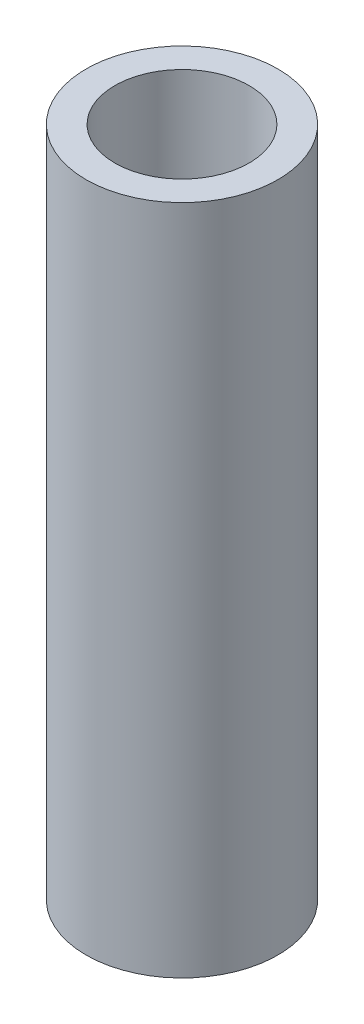
ISO-10303-21;
HEADER;
FILE_DESCRIPTION(('STEP AP214'),'2;1');
FILE_NAME('part.step','',(''),(''),'','','');
FILE_SCHEMA(('AUTOMOTIVE_DESIGN { 1 0 10303 214 1 1 1 1 }'));
ENDSEC;
DATA;
#1=APPLICATION_CONTEXT('core data for automotive mechanical design processes');
#2=APPLICATION_PROTOCOL_DEFINITION('international standard','automotive_design',2000,#1);
#3=PRODUCT_CONTEXT('',#1,'mechanical');
#4=PRODUCT('Part','Part','',(#3));
#5=PRODUCT_RELATED_PRODUCT_CATEGORY('part','',(#4));
#6=PRODUCT_DEFINITION_FORMATION('','',#4);
#7=PRODUCT_DEFINITION_CONTEXT('part definition',#1,'design');
#8=PRODUCT_DEFINITION('design','',#6,#7);
#9=PRODUCT_DEFINITION_SHAPE('','',#8);
#10=(LENGTH_UNIT() NAMED_UNIT(*) SI_UNIT(.MILLI.,.METRE.));
#11=(NAMED_UNIT(*) PLANE_ANGLE_UNIT() SI_UNIT($,.RADIAN.));
#12=(NAMED_UNIT(*) SI_UNIT($,.STERADIAN.) SOLID_ANGLE_UNIT());
#13=UNCERTAINTY_MEASURE_WITH_UNIT(LENGTH_MEASURE(1.E-05),#10,'distance_accuracy_value','');
#14=(GEOMETRIC_REPRESENTATION_CONTEXT(3) GLOBAL_UNCERTAINTY_ASSIGNED_CONTEXT((#13)) GLOBAL_UNIT_ASSIGNED_CONTEXT((#10,
#11,#12)) REPRESENTATION_CONTEXT('',''));
#15=CARTESIAN_POINT('',(0.,0.,0.));
#16=DIRECTION('',(0.,0.,1.));
#17=DIRECTION('',(1.,0.,0.));
#18=AXIS2_PLACEMENT_3D('',#15,#16,#17);
#19=CARTESIAN_POINT('',(0.,70.,0.));
#20=DIRECTION('',(0.,1.,0.));
#21=DIRECTION('',(0.,0.,1.));
#22=AXIS2_PLACEMENT_3D('',#19,#20,#21);
#23=PLANE('',#22);
#24=CARTESIAN_POINT('',(0.,70.,0.));
#25=DIRECTION('',(0.,1.,0.));
#26=DIRECTION('',(0.,0.,1.));
#27=AXIS2_PLACEMENT_3D('',#24,#25,#26);
#28=CIRCLE('',#27,10.);
#29=CARTESIAN_POINT('',(0.,70.,10.));
#30=VERTEX_POINT('',#29);
#31=EDGE_CURVE('E10',#30,#30,#28,.T.);
#32=ORIENTED_EDGE('',*,*,#31,.T.);
#33=EDGE_LOOP('',(#32));
#34=FACE_BOUND('',#33,.T.);
#35=CARTESIAN_POINT('',(0.,70.,0.));
#36=DIRECTION('',(0.,1.,0.));
#37=DIRECTION('',(0.,0.,1.));
#38=AXIS2_PLACEMENT_3D('',#35,#36,#37);
#39=CIRCLE('',#38,7.);
#40=CARTESIAN_POINT('',(0.,70.,7.));
#41=VERTEX_POINT('',#40);
#42=EDGE_CURVE('E55',#41,#41,#39,.T.);
#43=ORIENTED_EDGE('',*,*,#42,.F.);
#44=EDGE_LOOP('',(#43));
#45=FACE_BOUND('',#44,.T.);
#46=ADVANCED_FACE('F41',(#34,#45),#23,.T.);
#47=CARTESIAN_POINT('',(0.,0.,0.));
#48=DIRECTION('',(0.,1.,0.));
#49=DIRECTION('',(0.,0.,1.));
#50=AXIS2_PLACEMENT_3D('',#47,#48,#49);
#51=PLANE('',#50);
#52=CARTESIAN_POINT('',(0.,0.,0.));
#53=DIRECTION('',(0.,1.,0.));
#54=DIRECTION('',(0.,0.,1.));
#55=AXIS2_PLACEMENT_3D('',#52,#53,#54);
#56=CIRCLE('',#55,10.);
#57=CARTESIAN_POINT('',(0.,0.,10.));
#58=VERTEX_POINT('',#57);
#59=EDGE_CURVE('E44',#58,#58,#56,.T.);
#60=ORIENTED_EDGE('',*,*,#59,.F.);
#61=EDGE_LOOP('',(#60));
#62=FACE_BOUND('',#61,.T.);
#63=CARTESIAN_POINT('',(0.,0.,0.));
#64=DIRECTION('',(0.,1.,0.));
#65=DIRECTION('',(0.,0.,1.));
#66=AXIS2_PLACEMENT_3D('',#63,#64,#65);
#67=CIRCLE('',#66,7.);
#68=CARTESIAN_POINT('',(0.,0.,7.));
#69=VERTEX_POINT('',#68);
#70=EDGE_CURVE('E53',#69,#69,#67,.T.);
#71=ORIENTED_EDGE('',*,*,#70,.T.);
#72=EDGE_LOOP('',(#71));
#73=FACE_BOUND('',#72,.T.);
#74=ADVANCED_FACE('F61',(#62,#73),#51,.F.);
#75=CARTESIAN_POINT('',(0.,70.,0.));
#76=DIRECTION('',(0.,-1.,0.));
#77=DIRECTION('',(0.,0.,-1.));
#78=AXIS2_PLACEMENT_3D('',#75,#76,#77);
#79=CYLINDRICAL_SURFACE('',#78,10.);
#80=ORIENTED_EDGE('',*,*,#31,.F.);
#81=EDGE_LOOP('',(#80));
#82=FACE_BOUND('',#81,.T.);
#83=ORIENTED_EDGE('',*,*,#59,.T.);
#84=EDGE_LOOP('',(#83));
#85=FACE_BOUND('',#84,.T.);
#86=ADVANCED_FACE('F43',(#82,#85),#79,.T.);
#87=CARTESIAN_POINT('',(0.,70.,0.));
#88=DIRECTION('',(0.,-1.,0.));
#89=DIRECTION('',(0.,0.,-1.));
#90=AXIS2_PLACEMENT_3D('',#87,#88,#89);
#91=CYLINDRICAL_SURFACE('',#90,7.);
#92=ORIENTED_EDGE('',*,*,#42,.T.);
#93=EDGE_LOOP('',(#92));
#94=FACE_BOUND('',#93,.T.);
#95=ORIENTED_EDGE('',*,*,#70,.F.);
#96=EDGE_LOOP('',(#95));
#97=FACE_BOUND('',#96,.T.);
#98=ADVANCED_FACE('F58',(#94,#97),#91,.F.);
#99=CLOSED_SHELL('',(#46,#74,#86,#98));
#100=MANIFOLD_SOLID_BREP('B2',#99);
#101=ADVANCED_BREP_SHAPE_REPRESENTATION('',(#18,#100),#14);
#102=SHAPE_DEFINITION_REPRESENTATION(#9,#101);
ENDSEC;
END-ISO-10303-21;
